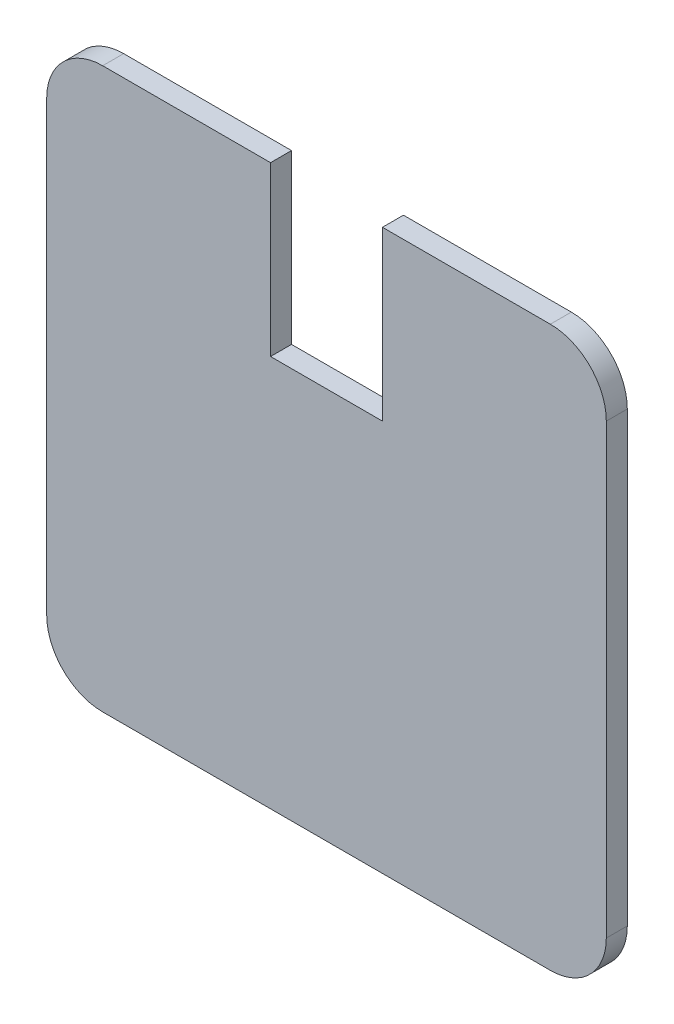
ISO-10303-21;
HEADER;
FILE_DESCRIPTION(('STEP AP214'),'2;1');
FILE_NAME('part.step','',(''),(''),'','','');
FILE_SCHEMA(('AUTOMOTIVE_DESIGN { 1 0 10303 214 1 1 1 1 }'));
ENDSEC;
DATA;
#1=APPLICATION_CONTEXT('core data for automotive mechanical design processes');
#2=APPLICATION_PROTOCOL_DEFINITION('international standard','automotive_design',2000,#1);
#3=PRODUCT_CONTEXT('',#1,'mechanical');
#4=PRODUCT('Part','Part','',(#3));
#5=PRODUCT_RELATED_PRODUCT_CATEGORY('part','',(#4));
#6=PRODUCT_DEFINITION_FORMATION('','',#4);
#7=PRODUCT_DEFINITION_CONTEXT('part definition',#1,'design');
#8=PRODUCT_DEFINITION('design','',#6,#7);
#9=PRODUCT_DEFINITION_SHAPE('','',#8);
#10=(LENGTH_UNIT() NAMED_UNIT(*) SI_UNIT(.MILLI.,.METRE.));
#11=(NAMED_UNIT(*) PLANE_ANGLE_UNIT() SI_UNIT($,.RADIAN.));
#12=(NAMED_UNIT(*) SI_UNIT($,.STERADIAN.) SOLID_ANGLE_UNIT());
#13=UNCERTAINTY_MEASURE_WITH_UNIT(LENGTH_MEASURE(1.E-05),#10,'distance_accuracy_value','');
#14=(GEOMETRIC_REPRESENTATION_CONTEXT(3) GLOBAL_UNCERTAINTY_ASSIGNED_CONTEXT((#13)) GLOBAL_UNIT_ASSIGNED_CONTEXT((#10,
#11,#12)) REPRESENTATION_CONTEXT('',''));
#15=CARTESIAN_POINT('',(0.,0.,0.));
#16=DIRECTION('',(0.,0.,1.));
#17=DIRECTION('',(1.,0.,0.));
#18=AXIS2_PLACEMENT_3D('',#15,#16,#17);
#19=CARTESIAN_POINT('',(12.7,25.4,4.7625));
#20=DIRECTION('',(1.,0.,0.));
#21=DIRECTION('',(0.,1.,0.));
#22=AXIS2_PLACEMENT_3D('',#19,#20,#21);
#23=PLANE('',#22);
#24=DIRECTION('',(0.,-1.,0.));
#25=VECTOR('',#24,1.);
#26=CARTESIAN_POINT('',(12.7,25.4,0.));
#27=LINE('',#26,#25);
#28=CARTESIAN_POINT('',(12.7,63.5,0.));
#29=VERTEX_POINT('',#28);
#30=CARTESIAN_POINT('',(12.7,25.4,0.));
#31=VERTEX_POINT('',#30);
#32=EDGE_CURVE('E159',#29,#31,#27,.T.);
#33=ORIENTED_EDGE('',*,*,#32,.T.);
#34=DIRECTION('',(0.,0.,-1.));
#35=VECTOR('',#34,1.);
#36=CARTESIAN_POINT('',(12.7,25.4,4.7625));
#37=LINE('',#36,#35);
#38=CARTESIAN_POINT('',(12.7,25.4,4.7625));
#39=VERTEX_POINT('',#38);
#40=EDGE_CURVE('E11',#39,#31,#37,.T.);
#41=ORIENTED_EDGE('',*,*,#40,.F.);
#42=DIRECTION('',(0.,-1.,0.));
#43=VECTOR('',#42,1.);
#44=CARTESIAN_POINT('',(12.7,25.4,4.7625));
#45=LINE('',#44,#43);
#46=CARTESIAN_POINT('',(12.7,63.5,4.7625));
#47=VERTEX_POINT('',#46);
#48=EDGE_CURVE('E181',#47,#39,#45,.T.);
#49=ORIENTED_EDGE('',*,*,#48,.F.);
#50=DIRECTION('',(0.,0.,-1.));
#51=VECTOR('',#50,1.);
#52=CARTESIAN_POINT('',(12.7,63.5,4.7625));
#53=LINE('',#52,#51);
#54=EDGE_CURVE('E155',#47,#29,#53,.T.);
#55=ORIENTED_EDGE('',*,*,#54,.T.);
#56=EDGE_LOOP('',(#33,#41,#49,#55));
#57=FACE_BOUND('',#56,.T.);
#58=ADVANCED_FACE('F39',(#57),#23,.F.);
#59=CARTESIAN_POINT('',(-12.7,25.4,4.7625));
#60=DIRECTION('',(0.,-1.,0.));
#61=DIRECTION('',(0.,0.,-1.));
#62=AXIS2_PLACEMENT_3D('',#59,#60,#61);
#63=PLANE('',#62);
#64=DIRECTION('',(-1.,0.,0.));
#65=VECTOR('',#64,1.);
#66=CARTESIAN_POINT('',(-12.7,25.4,0.));
#67=LINE('',#66,#65);
#68=CARTESIAN_POINT('',(-12.7,25.4,0.));
#69=VERTEX_POINT('',#68);
#70=EDGE_CURVE('E162',#31,#69,#67,.T.);
#71=ORIENTED_EDGE('',*,*,#70,.T.);
#72=DIRECTION('',(0.,0.,-1.));
#73=VECTOR('',#72,1.);
#74=CARTESIAN_POINT('',(-12.7,25.4,4.7625));
#75=LINE('',#74,#73);
#76=CARTESIAN_POINT('',(-12.7,25.4,4.7625));
#77=VERTEX_POINT('',#76);
#78=EDGE_CURVE('E47',#77,#69,#75,.T.);
#79=ORIENTED_EDGE('',*,*,#78,.F.);
#80=DIRECTION('',(-1.,0.,0.));
#81=VECTOR('',#80,1.);
#82=CARTESIAN_POINT('',(-12.7,25.4,4.7625));
#83=LINE('',#82,#81);
#84=EDGE_CURVE('E110',#39,#77,#83,.T.);
#85=ORIENTED_EDGE('',*,*,#84,.F.);
#86=ORIENTED_EDGE('',*,*,#40,.T.);
#87=EDGE_LOOP('',(#71,#79,#85,#86));
#88=FACE_BOUND('',#87,.T.);
#89=ADVANCED_FACE('F259',(#88),#63,.F.);
#90=CARTESIAN_POINT('',(-12.7,63.5,4.7625));
#91=DIRECTION('',(-1.,0.,0.));
#92=DIRECTION('',(0.,-1.,0.));
#93=AXIS2_PLACEMENT_3D('',#90,#91,#92);
#94=PLANE('',#93);
#95=DIRECTION('',(0.,1.,0.));
#96=VECTOR('',#95,1.);
#97=CARTESIAN_POINT('',(-12.7,63.5,0.));
#98=LINE('',#97,#96);
#99=CARTESIAN_POINT('',(-12.7,63.5,0.));
#100=VERTEX_POINT('',#99);
#101=EDGE_CURVE('E164',#69,#100,#98,.T.);
#102=ORIENTED_EDGE('',*,*,#101,.T.);
#103=DIRECTION('',(0.,0.,-1.));
#104=VECTOR('',#103,1.);
#105=CARTESIAN_POINT('',(-12.7,63.5,4.7625));
#106=LINE('',#105,#104);
#107=CARTESIAN_POINT('',(-12.7,63.5,4.7625));
#108=VERTEX_POINT('',#107);
#109=EDGE_CURVE('E200',#108,#100,#106,.T.);
#110=ORIENTED_EDGE('',*,*,#109,.F.);
#111=DIRECTION('',(0.,1.,0.));
#112=VECTOR('',#111,1.);
#113=CARTESIAN_POINT('',(-12.7,63.5,4.7625));
#114=LINE('',#113,#112);
#115=EDGE_CURVE('E208',#77,#108,#114,.T.);
#116=ORIENTED_EDGE('',*,*,#115,.F.);
#117=ORIENTED_EDGE('',*,*,#78,.T.);
#118=EDGE_LOOP('',(#102,#110,#116,#117));
#119=FACE_BOUND('',#118,.T.);
#120=ADVANCED_FACE('F206',(#119),#94,.F.);
#121=CARTESIAN_POINT('',(-12.7,63.5,4.7625));
#122=DIRECTION('',(0.,-1.,0.));
#123=DIRECTION('',(1.,0.,0.));
#124=AXIS2_PLACEMENT_3D('',#121,#122,#123);
#125=PLANE('',#124);
#126=DIRECTION('',(-1.,0.,0.));
#127=VECTOR('',#126,1.);
#128=CARTESIAN_POINT('',(-12.7,63.5,0.));
#129=LINE('',#128,#127);
#130=CARTESIAN_POINT('',(-50.8,63.5,0.));
#131=VERTEX_POINT('',#130);
#132=EDGE_CURVE('E166',#100,#131,#129,.T.);
#133=ORIENTED_EDGE('',*,*,#132,.T.);
#134=DIRECTION('',(0.,0.,-1.));
#135=VECTOR('',#134,1.);
#136=CARTESIAN_POINT('',(-50.8,63.5,4.7625));
#137=LINE('',#136,#135);
#138=CARTESIAN_POINT('',(-50.8,63.5,4.7625));
#139=VERTEX_POINT('',#138);
#140=EDGE_CURVE('E197',#139,#131,#137,.T.);
#141=ORIENTED_EDGE('',*,*,#140,.F.);
#142=DIRECTION('',(-1.,0.,0.));
#143=VECTOR('',#142,1.);
#144=CARTESIAN_POINT('',(-12.7,63.5,4.7625));
#145=LINE('',#144,#143);
#146=EDGE_CURVE('E226',#108,#139,#145,.T.);
#147=ORIENTED_EDGE('',*,*,#146,.F.);
#148=ORIENTED_EDGE('',*,*,#109,.T.);
#149=EDGE_LOOP('',(#133,#141,#147,#148));
#150=FACE_BOUND('',#149,.T.);
#151=ADVANCED_FACE('F217',(#150),#125,.F.);
#152=CARTESIAN_POINT('',(-50.8,50.8,4.7625));
#153=DIRECTION('',(0.,0.,-1.));
#154=DIRECTION('',(-1.,0.,0.));
#155=AXIS2_PLACEMENT_3D('',#152,#153,#154);
#156=CYLINDRICAL_SURFACE('',#155,12.7);
#157=CARTESIAN_POINT('',(-50.8,50.8,0.));
#158=DIRECTION('',(0.,0.,1.));
#159=DIRECTION('',(1.,0.,0.));
#160=AXIS2_PLACEMENT_3D('',#157,#158,#159);
#161=CIRCLE('',#160,12.7);
#162=CARTESIAN_POINT('',(-63.5,50.8,0.));
#163=VERTEX_POINT('',#162);
#164=EDGE_CURVE('E168',#131,#163,#161,.T.);
#165=ORIENTED_EDGE('',*,*,#164,.T.);
#166=DIRECTION('',(0.,0.,-1.));
#167=VECTOR('',#166,1.);
#168=CARTESIAN_POINT('',(-63.5,50.8,4.7625));
#169=LINE('',#168,#167);
#170=CARTESIAN_POINT('',(-63.5,50.8,4.7625));
#171=VERTEX_POINT('',#170);
#172=EDGE_CURVE('E194',#171,#163,#169,.T.);
#173=ORIENTED_EDGE('',*,*,#172,.F.);
#174=CARTESIAN_POINT('',(-50.8,50.8,4.7625));
#175=DIRECTION('',(0.,0.,1.));
#176=DIRECTION('',(1.,0.,0.));
#177=AXIS2_PLACEMENT_3D('',#174,#175,#176);
#178=CIRCLE('',#177,12.7);
#179=EDGE_CURVE('E223',#139,#171,#178,.T.);
#180=ORIENTED_EDGE('',*,*,#179,.F.);
#181=ORIENTED_EDGE('',*,*,#140,.T.);
#182=EDGE_LOOP('',(#165,#173,#180,#181));
#183=FACE_BOUND('',#182,.T.);
#184=ADVANCED_FACE('F221',(#183),#156,.T.);
#185=CARTESIAN_POINT('',(-63.5,50.8,4.7625));
#186=DIRECTION('',(1.,0.,0.));
#187=DIRECTION('',(0.,1.,0.));
#188=AXIS2_PLACEMENT_3D('',#185,#186,#187);
#189=PLANE('',#188);
#190=DIRECTION('',(0.,-1.,0.));
#191=VECTOR('',#190,1.);
#192=CARTESIAN_POINT('',(-63.5,50.8,0.));
#193=LINE('',#192,#191);
#194=CARTESIAN_POINT('',(-63.5,-50.8,0.));
#195=VERTEX_POINT('',#194);
#196=EDGE_CURVE('E170',#163,#195,#193,.T.);
#197=ORIENTED_EDGE('',*,*,#196,.T.);
#198=DIRECTION('',(0.,0.,-1.));
#199=VECTOR('',#198,1.);
#200=CARTESIAN_POINT('',(-63.5,-50.8,4.7625));
#201=LINE('',#200,#199);
#202=CARTESIAN_POINT('',(-63.5,-50.8,4.7625));
#203=VERTEX_POINT('',#202);
#204=EDGE_CURVE('E191',#203,#195,#201,.T.);
#205=ORIENTED_EDGE('',*,*,#204,.F.);
#206=DIRECTION('',(0.,-1.,0.));
#207=VECTOR('',#206,1.);
#208=CARTESIAN_POINT('',(-63.5,50.8,4.7625));
#209=LINE('',#208,#207);
#210=EDGE_CURVE('E225',#171,#203,#209,.T.);
#211=ORIENTED_EDGE('',*,*,#210,.F.);
#212=ORIENTED_EDGE('',*,*,#172,.T.);
#213=EDGE_LOOP('',(#197,#205,#211,#212));
#214=FACE_BOUND('',#213,.T.);
#215=ADVANCED_FACE('F272',(#214),#189,.F.);
#216=CARTESIAN_POINT('',(-50.8,-50.8,4.7625));
#217=DIRECTION('',(0.,0.,-1.));
#218=DIRECTION('',(-1.,0.,0.));
#219=AXIS2_PLACEMENT_3D('',#216,#217,#218);
#220=CYLINDRICAL_SURFACE('',#219,12.7);
#221=CARTESIAN_POINT('',(-50.8,-50.8,0.));
#222=DIRECTION('',(0.,0.,1.));
#223=DIRECTION('',(1.,0.,0.));
#224=AXIS2_PLACEMENT_3D('',#221,#222,#223);
#225=CIRCLE('',#224,12.7);
#226=CARTESIAN_POINT('',(-50.8,-63.5,0.));
#227=VERTEX_POINT('',#226);
#228=EDGE_CURVE('E172',#195,#227,#225,.T.);
#229=ORIENTED_EDGE('',*,*,#228,.T.);
#230=DIRECTION('',(0.,0.,-1.));
#231=VECTOR('',#230,1.);
#232=CARTESIAN_POINT('',(-50.8,-63.5,4.7625));
#233=LINE('',#232,#231);
#234=CARTESIAN_POINT('',(-50.8,-63.5,4.7625));
#235=VERTEX_POINT('',#234);
#236=EDGE_CURVE('E188',#235,#227,#233,.T.);
#237=ORIENTED_EDGE('',*,*,#236,.F.);
#238=CARTESIAN_POINT('',(-50.8,-50.8,4.7625));
#239=DIRECTION('',(0.,0.,1.));
#240=DIRECTION('',(1.,0.,0.));
#241=AXIS2_PLACEMENT_3D('',#238,#239,#240);
#242=CIRCLE('',#241,12.7);
#243=EDGE_CURVE('E228',#203,#235,#242,.T.);
#244=ORIENTED_EDGE('',*,*,#243,.F.);
#245=ORIENTED_EDGE('',*,*,#204,.T.);
#246=EDGE_LOOP('',(#229,#237,#244,#245));
#247=FACE_BOUND('',#246,.T.);
#248=ADVANCED_FACE('F275',(#247),#220,.T.);
#249=CARTESIAN_POINT('',(-50.8,-63.5,4.7625));
#250=DIRECTION('',(0.,1.,0.));
#251=DIRECTION('',(0.,0.,1.));
#252=AXIS2_PLACEMENT_3D('',#249,#250,#251);
#253=PLANE('',#252);
#254=DIRECTION('',(1.,0.,0.));
#255=VECTOR('',#254,1.);
#256=CARTESIAN_POINT('',(-50.8,-63.5,0.));
#257=LINE('',#256,#255);
#258=CARTESIAN_POINT('',(50.8,-63.5,0.));
#259=VERTEX_POINT('',#258);
#260=EDGE_CURVE('E174',#227,#259,#257,.T.);
#261=ORIENTED_EDGE('',*,*,#260,.T.);
#262=DIRECTION('',(0.,0.,-1.));
#263=VECTOR('',#262,1.);
#264=CARTESIAN_POINT('',(50.8,-63.5,4.7625));
#265=LINE('',#264,#263);
#266=CARTESIAN_POINT('',(50.8,-63.5,4.7625));
#267=VERTEX_POINT('',#266);
#268=EDGE_CURVE('E185',#267,#259,#265,.T.);
#269=ORIENTED_EDGE('',*,*,#268,.F.);
#270=DIRECTION('',(1.,0.,0.));
#271=VECTOR('',#270,1.);
#272=CARTESIAN_POINT('',(-50.8,-63.5,4.7625));
#273=LINE('',#272,#271);
#274=EDGE_CURVE('E234',#235,#267,#273,.T.);
#275=ORIENTED_EDGE('',*,*,#274,.F.);
#276=ORIENTED_EDGE('',*,*,#236,.T.);
#277=EDGE_LOOP('',(#261,#269,#275,#276));
#278=FACE_BOUND('',#277,.T.);
#279=ADVANCED_FACE('F240',(#278),#253,.F.);
#280=CARTESIAN_POINT('',(50.8,-50.8,4.7625));
#281=DIRECTION('',(0.,0.,-1.));
#282=DIRECTION('',(-1.,0.,0.));
#283=AXIS2_PLACEMENT_3D('',#280,#281,#282);
#284=CYLINDRICAL_SURFACE('',#283,12.7);
#285=CARTESIAN_POINT('',(50.8,-50.8,0.));
#286=DIRECTION('',(0.,0.,1.));
#287=DIRECTION('',(1.,0.,0.));
#288=AXIS2_PLACEMENT_3D('',#285,#286,#287);
#289=CIRCLE('',#288,12.7);
#290=CARTESIAN_POINT('',(63.5,-50.8,0.));
#291=VERTEX_POINT('',#290);
#292=EDGE_CURVE('E176',#259,#291,#289,.T.);
#293=ORIENTED_EDGE('',*,*,#292,.T.);
#294=DIRECTION('',(0.,0.,-1.));
#295=VECTOR('',#294,1.);
#296=CARTESIAN_POINT('',(63.5,-50.8,4.7625));
#297=LINE('',#296,#295);
#298=CARTESIAN_POINT('',(63.5,-50.8,4.7625));
#299=VERTEX_POINT('',#298);
#300=EDGE_CURVE('E150',#299,#291,#297,.T.);
#301=ORIENTED_EDGE('',*,*,#300,.F.);
#302=CARTESIAN_POINT('',(50.8,-50.8,4.7625));
#303=DIRECTION('',(0.,0.,1.));
#304=DIRECTION('',(1.,0.,0.));
#305=AXIS2_PLACEMENT_3D('',#302,#303,#304);
#306=CIRCLE('',#305,12.7);
#307=EDGE_CURVE('E141',#267,#299,#306,.T.);
#308=ORIENTED_EDGE('',*,*,#307,.F.);
#309=ORIENTED_EDGE('',*,*,#268,.T.);
#310=EDGE_LOOP('',(#293,#301,#308,#309));
#311=FACE_BOUND('',#310,.T.);
#312=ADVANCED_FACE('F244',(#311),#284,.T.);
#313=CARTESIAN_POINT('',(63.5,50.8,4.7625));
#314=DIRECTION('',(-1.,0.,0.));
#315=DIRECTION('',(0.,-1.,0.));
#316=AXIS2_PLACEMENT_3D('',#313,#314,#315);
#317=PLANE('',#316);
#318=DIRECTION('',(0.,1.,0.));
#319=VECTOR('',#318,1.);
#320=CARTESIAN_POINT('',(63.5,50.8,0.));
#321=LINE('',#320,#319);
#322=CARTESIAN_POINT('',(63.5,50.8,0.));
#323=VERTEX_POINT('',#322);
#324=EDGE_CURVE('E149',#291,#323,#321,.T.);
#325=ORIENTED_EDGE('',*,*,#324,.T.);
#326=DIRECTION('',(0.,0.,-1.));
#327=VECTOR('',#326,1.);
#328=CARTESIAN_POINT('',(63.5,50.8,4.7625));
#329=LINE('',#328,#327);
#330=CARTESIAN_POINT('',(63.5,50.8,4.7625));
#331=VERTEX_POINT('',#330);
#332=EDGE_CURVE('E146',#331,#323,#329,.T.);
#333=ORIENTED_EDGE('',*,*,#332,.F.);
#334=DIRECTION('',(0.,1.,0.));
#335=VECTOR('',#334,1.);
#336=CARTESIAN_POINT('',(63.5,50.8,4.7625));
#337=LINE('',#336,#335);
#338=EDGE_CURVE('E135',#299,#331,#337,.T.);
#339=ORIENTED_EDGE('',*,*,#338,.F.);
#340=ORIENTED_EDGE('',*,*,#300,.T.);
#341=EDGE_LOOP('',(#325,#333,#339,#340));
#342=FACE_BOUND('',#341,.T.);
#343=ADVANCED_FACE('F147',(#342),#317,.F.);
#344=CARTESIAN_POINT('',(50.8,50.8,4.7625));
#345=DIRECTION('',(0.,0.,-1.));
#346=DIRECTION('',(-1.,0.,0.));
#347=AXIS2_PLACEMENT_3D('',#344,#345,#346);
#348=CYLINDRICAL_SURFACE('',#347,12.7);
#349=CARTESIAN_POINT('',(50.8,50.8,0.));
#350=DIRECTION('',(0.,0.,1.));
#351=DIRECTION('',(1.,0.,0.));
#352=AXIS2_PLACEMENT_3D('',#349,#350,#351);
#353=CIRCLE('',#352,12.7);
#354=CARTESIAN_POINT('',(50.8,63.5,0.));
#355=VERTEX_POINT('',#354);
#356=EDGE_CURVE('E96',#323,#355,#353,.T.);
#357=ORIENTED_EDGE('',*,*,#356,.T.);
#358=DIRECTION('',(0.,0.,-1.));
#359=VECTOR('',#358,1.);
#360=CARTESIAN_POINT('',(50.8,63.5,4.7625));
#361=LINE('',#360,#359);
#362=CARTESIAN_POINT('',(50.8,63.5,4.7625));
#363=VERTEX_POINT('',#362);
#364=EDGE_CURVE('E151',#363,#355,#361,.T.);
#365=ORIENTED_EDGE('',*,*,#364,.F.);
#366=CARTESIAN_POINT('',(50.8,50.8,4.7625));
#367=DIRECTION('',(0.,0.,1.));
#368=DIRECTION('',(1.,0.,0.));
#369=AXIS2_PLACEMENT_3D('',#366,#367,#368);
#370=CIRCLE('',#369,12.7);
#371=EDGE_CURVE('E139',#331,#363,#370,.T.);
#372=ORIENTED_EDGE('',*,*,#371,.F.);
#373=ORIENTED_EDGE('',*,*,#332,.T.);
#374=EDGE_LOOP('',(#357,#365,#372,#373));
#375=FACE_BOUND('',#374,.T.);
#376=ADVANCED_FACE('F153',(#375),#348,.T.);
#377=CARTESIAN_POINT('',(50.8,63.5,4.7625));
#378=DIRECTION('',(0.,-1.,0.));
#379=DIRECTION('',(0.,0.,-1.));
#380=AXIS2_PLACEMENT_3D('',#377,#378,#379);
#381=PLANE('',#380);
#382=DIRECTION('',(-1.,0.,0.));
#383=VECTOR('',#382,1.);
#384=CARTESIAN_POINT('',(50.8,63.5,0.));
#385=LINE('',#384,#383);
#386=EDGE_CURVE('E102',#355,#29,#385,.T.);
#387=ORIENTED_EDGE('',*,*,#386,.T.);
#388=ORIENTED_EDGE('',*,*,#54,.F.);
#389=DIRECTION('',(-1.,0.,0.));
#390=VECTOR('',#389,1.);
#391=CARTESIAN_POINT('',(50.8,63.5,4.7625));
#392=LINE('',#391,#390);
#393=EDGE_CURVE('E55',#363,#47,#392,.T.);
#394=ORIENTED_EDGE('',*,*,#393,.F.);
#395=ORIENTED_EDGE('',*,*,#364,.T.);
#396=EDGE_LOOP('',(#387,#388,#394,#395));
#397=FACE_BOUND('',#396,.T.);
#398=ADVANCED_FACE('F248',(#397),#381,.F.);
#399=CARTESIAN_POINT('',(50.8,50.8,4.7625));
#400=DIRECTION('',(0.,0.,1.));
#401=DIRECTION('',(1.,0.,0.));
#402=AXIS2_PLACEMENT_3D('',#399,#400,#401);
#403=PLANE('',#402);
#404=ORIENTED_EDGE('',*,*,#48,.T.);
#405=ORIENTED_EDGE('',*,*,#84,.T.);
#406=ORIENTED_EDGE('',*,*,#115,.T.);
#407=ORIENTED_EDGE('',*,*,#146,.T.);
#408=ORIENTED_EDGE('',*,*,#179,.T.);
#409=ORIENTED_EDGE('',*,*,#210,.T.);
#410=ORIENTED_EDGE('',*,*,#243,.T.);
#411=ORIENTED_EDGE('',*,*,#274,.T.);
#412=ORIENTED_EDGE('',*,*,#307,.T.);
#413=ORIENTED_EDGE('',*,*,#338,.T.);
#414=ORIENTED_EDGE('',*,*,#371,.T.);
#415=ORIENTED_EDGE('',*,*,#393,.T.);
#416=EDGE_LOOP('',(#404,#405,#406,#407,#408,#409,#410,#411,#412,#413,#414,#415));
#417=FACE_BOUND('',#416,.T.);
#418=ADVANCED_FACE('F137',(#417),#403,.T.);
#419=CARTESIAN_POINT('',(50.8,50.8,0.));
#420=DIRECTION('',(0.,0.,1.));
#421=DIRECTION('',(1.,0.,0.));
#422=AXIS2_PLACEMENT_3D('',#419,#420,#421);
#423=PLANE('',#422);
#424=ORIENTED_EDGE('',*,*,#32,.F.);
#425=ORIENTED_EDGE('',*,*,#386,.F.);
#426=ORIENTED_EDGE('',*,*,#356,.F.);
#427=ORIENTED_EDGE('',*,*,#324,.F.);
#428=ORIENTED_EDGE('',*,*,#292,.F.);
#429=ORIENTED_EDGE('',*,*,#260,.F.);
#430=ORIENTED_EDGE('',*,*,#228,.F.);
#431=ORIENTED_EDGE('',*,*,#196,.F.);
#432=ORIENTED_EDGE('',*,*,#164,.F.);
#433=ORIENTED_EDGE('',*,*,#132,.F.);
#434=ORIENTED_EDGE('',*,*,#101,.F.);
#435=ORIENTED_EDGE('',*,*,#70,.F.);
#436=EDGE_LOOP('',(#424,#425,#426,#427,#428,#429,#430,#431,#432,#433,#434,#435));
#437=FACE_BOUND('',#436,.T.);
#438=ADVANCED_FACE('F212',(#437),#423,.F.);
#439=CLOSED_SHELL('',(#58,#89,#120,#151,#184,#215,#248,#279,#312,#343,#376,#398,#418,#438));
#440=MANIFOLD_SOLID_BREP('B2',#439);
#441=ADVANCED_BREP_SHAPE_REPRESENTATION('',(#18,#440),#14);
#442=SHAPE_DEFINITION_REPRESENTATION(#9,#441);
ENDSEC;
END-ISO-10303-21;
